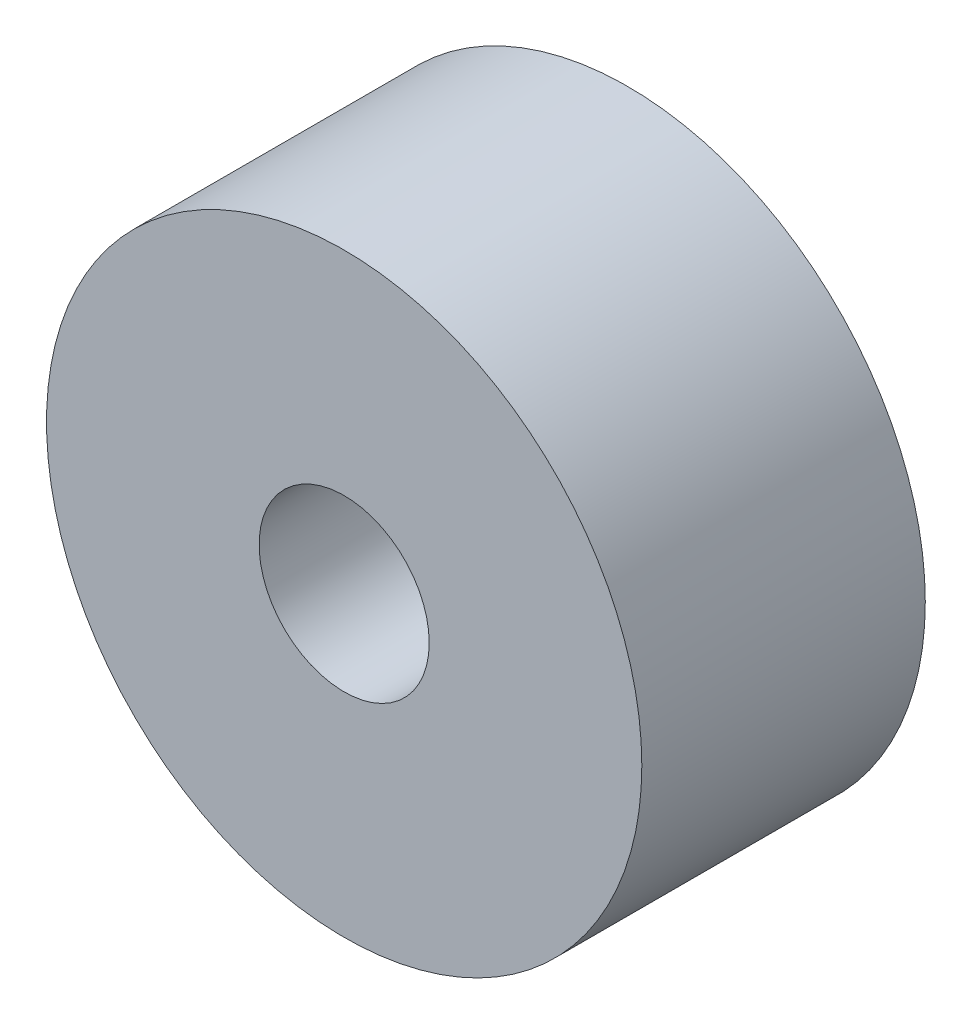
ISO-10303-21;
HEADER;
FILE_DESCRIPTION(('STEP AP214'),'2;1');
FILE_NAME('part.step','',(''),(''),'','','');
FILE_SCHEMA(('AUTOMOTIVE_DESIGN { 1 0 10303 214 1 1 1 1 }'));
ENDSEC;
DATA;
#1=APPLICATION_CONTEXT('core data for automotive mechanical design processes');
#2=APPLICATION_PROTOCOL_DEFINITION('international standard','automotive_design',2000,#1);
#3=PRODUCT_CONTEXT('',#1,'mechanical');
#4=PRODUCT('Part','Part','',(#3));
#5=PRODUCT_RELATED_PRODUCT_CATEGORY('part','',(#4));
#6=PRODUCT_DEFINITION_FORMATION('','',#4);
#7=PRODUCT_DEFINITION_CONTEXT('part definition',#1,'design');
#8=PRODUCT_DEFINITION('design','',#6,#7);
#9=PRODUCT_DEFINITION_SHAPE('','',#8);
#10=(LENGTH_UNIT() NAMED_UNIT(*) SI_UNIT(.MILLI.,.METRE.));
#11=(NAMED_UNIT(*) PLANE_ANGLE_UNIT() SI_UNIT($,.RADIAN.));
#12=(NAMED_UNIT(*) SI_UNIT($,.STERADIAN.) SOLID_ANGLE_UNIT());
#13=UNCERTAINTY_MEASURE_WITH_UNIT(LENGTH_MEASURE(1.E-05),#10,'distance_accuracy_value','');
#14=(GEOMETRIC_REPRESENTATION_CONTEXT(3) GLOBAL_UNCERTAINTY_ASSIGNED_CONTEXT((#13)) GLOBAL_UNIT_ASSIGNED_CONTEXT((#10,
#11,#12)) REPRESENTATION_CONTEXT('',''));
#15=CARTESIAN_POINT('',(0.,0.,0.));
#16=DIRECTION('',(0.,0.,1.));
#17=DIRECTION('',(1.,0.,0.));
#18=AXIS2_PLACEMENT_3D('',#15,#16,#17);
#19=CARTESIAN_POINT('',(0.,0.,10.));
#20=DIRECTION('',(0.,0.,1.));
#21=DIRECTION('',(1.,0.,0.));
#22=AXIS2_PLACEMENT_3D('',#19,#20,#21);
#23=PLANE('',#22);
#24=CARTESIAN_POINT('',(0.,0.,10.));
#25=DIRECTION('',(0.,0.,1.));
#26=DIRECTION('',(1.,0.,0.));
#27=AXIS2_PLACEMENT_3D('',#24,#25,#26);
#28=CIRCLE('',#27,21.);
#29=CARTESIAN_POINT('',(21.,0.,10.));
#30=VERTEX_POINT('',#29);
#31=EDGE_CURVE('E10',#30,#30,#28,.T.);
#32=ORIENTED_EDGE('',*,*,#31,.T.);
#33=EDGE_LOOP('',(#32));
#34=FACE_BOUND('',#33,.T.);
#35=CARTESIAN_POINT('',(0.,0.,10.));
#36=DIRECTION('',(0.,0.,1.));
#37=DIRECTION('',(1.,0.,0.));
#38=AXIS2_PLACEMENT_3D('',#35,#36,#37);
#39=CIRCLE('',#38,6.);
#40=CARTESIAN_POINT('',(6.,0.,10.));
#41=VERTEX_POINT('',#40);
#42=EDGE_CURVE('E52',#41,#41,#39,.T.);
#43=ORIENTED_EDGE('',*,*,#42,.F.);
#44=EDGE_LOOP('',(#43));
#45=FACE_BOUND('',#44,.T.);
#46=ADVANCED_FACE('F41',(#34,#45),#23,.T.);
#47=CARTESIAN_POINT('',(0.,0.,-10.));
#48=DIRECTION('',(0.,0.,1.));
#49=DIRECTION('',(1.,0.,0.));
#50=AXIS2_PLACEMENT_3D('',#47,#48,#49);
#51=PLANE('',#50);
#52=CARTESIAN_POINT('',(0.,0.,-10.));
#53=DIRECTION('',(0.,0.,1.));
#54=DIRECTION('',(1.,0.,0.));
#55=AXIS2_PLACEMENT_3D('',#52,#53,#54);
#56=CIRCLE('',#55,21.);
#57=CARTESIAN_POINT('',(21.,0.,-10.));
#58=VERTEX_POINT('',#57);
#59=EDGE_CURVE('E45',#58,#58,#56,.T.);
#60=ORIENTED_EDGE('',*,*,#59,.F.);
#61=EDGE_LOOP('',(#60));
#62=FACE_BOUND('',#61,.T.);
#63=CARTESIAN_POINT('',(0.,0.,-10.));
#64=DIRECTION('',(0.,0.,1.));
#65=DIRECTION('',(1.,0.,0.));
#66=AXIS2_PLACEMENT_3D('',#63,#64,#65);
#67=CIRCLE('',#66,6.);
#68=CARTESIAN_POINT('',(6.,0.,-10.));
#69=VERTEX_POINT('',#68);
#70=EDGE_CURVE('E54',#69,#69,#67,.T.);
#71=ORIENTED_EDGE('',*,*,#70,.T.);
#72=EDGE_LOOP('',(#71));
#73=FACE_BOUND('',#72,.T.);
#74=ADVANCED_FACE('F64',(#62,#73),#51,.F.);
#75=CARTESIAN_POINT('',(0.,0.,10.));
#76=DIRECTION('',(0.,0.,-1.));
#77=DIRECTION('',(-1.,0.,0.));
#78=AXIS2_PLACEMENT_3D('',#75,#76,#77);
#79=CYLINDRICAL_SURFACE('',#78,21.);
#80=ORIENTED_EDGE('',*,*,#31,.F.);
#81=EDGE_LOOP('',(#80));
#82=FACE_BOUND('',#81,.T.);
#83=ORIENTED_EDGE('',*,*,#59,.T.);
#84=EDGE_LOOP('',(#83));
#85=FACE_BOUND('',#84,.T.);
#86=ADVANCED_FACE('F43',(#82,#85),#79,.T.);
#87=CARTESIAN_POINT('',(0.,0.,10.));
#88=DIRECTION('',(0.,0.,-1.));
#89=DIRECTION('',(-1.,0.,0.));
#90=AXIS2_PLACEMENT_3D('',#87,#88,#89);
#91=CYLINDRICAL_SURFACE('',#90,6.);
#92=ORIENTED_EDGE('',*,*,#42,.T.);
#93=EDGE_LOOP('',(#92));
#94=FACE_BOUND('',#93,.T.);
#95=ORIENTED_EDGE('',*,*,#70,.F.);
#96=EDGE_LOOP('',(#95));
#97=FACE_BOUND('',#96,.T.);
#98=ADVANCED_FACE('F60',(#94,#97),#91,.F.);
#99=CLOSED_SHELL('',(#46,#74,#86,#98));
#100=MANIFOLD_SOLID_BREP('B2',#99);
#101=ADVANCED_BREP_SHAPE_REPRESENTATION('',(#18,#100),#14);
#102=SHAPE_DEFINITION_REPRESENTATION(#9,#101);
ENDSEC;
END-ISO-10303-21;
